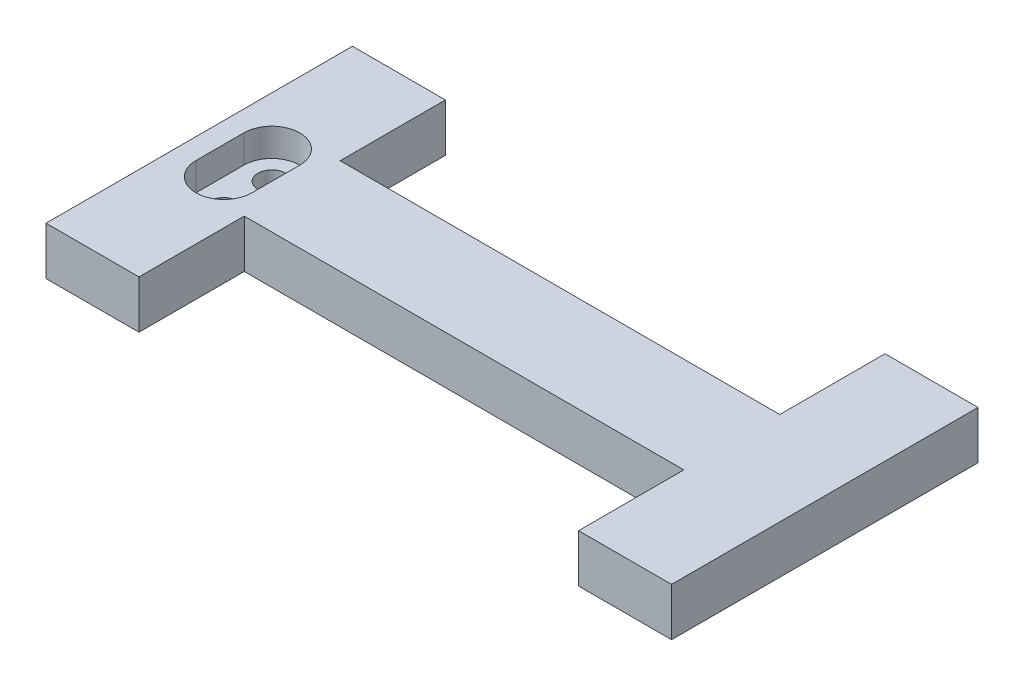
ISO-10303-21;
HEADER;
FILE_DESCRIPTION(('STEP AP214'),'2;1');
FILE_NAME('part.step','',(''),(''),'','','');
FILE_SCHEMA(('AUTOMOTIVE_DESIGN { 1 0 10303 214 1 1 1 1 }'));
ENDSEC;
DATA;
#1=APPLICATION_CONTEXT('core data for automotive mechanical design processes');
#2=APPLICATION_PROTOCOL_DEFINITION('international standard','automotive_design',2000,#1);
#3=PRODUCT_CONTEXT('',#1,'mechanical');
#4=PRODUCT('Part','Part','',(#3));
#5=PRODUCT_RELATED_PRODUCT_CATEGORY('part','',(#4));
#6=PRODUCT_DEFINITION_FORMATION('','',#4);
#7=PRODUCT_DEFINITION_CONTEXT('part definition',#1,'design');
#8=PRODUCT_DEFINITION('design','',#6,#7);
#9=PRODUCT_DEFINITION_SHAPE('','',#8);
#10=(LENGTH_UNIT() NAMED_UNIT(*) SI_UNIT(.MILLI.,.METRE.));
#11=(NAMED_UNIT(*) PLANE_ANGLE_UNIT() SI_UNIT($,.RADIAN.));
#12=(NAMED_UNIT(*) SI_UNIT($,.STERADIAN.) SOLID_ANGLE_UNIT());
#13=UNCERTAINTY_MEASURE_WITH_UNIT(LENGTH_MEASURE(1.E-05),#10,'distance_accuracy_value','');
#14=(GEOMETRIC_REPRESENTATION_CONTEXT(3) GLOBAL_UNCERTAINTY_ASSIGNED_CONTEXT((#13)) GLOBAL_UNIT_ASSIGNED_CONTEXT((#10,
#11,#12)) REPRESENTATION_CONTEXT('',''));
#15=CARTESIAN_POINT('',(0.,0.,0.));
#16=DIRECTION('',(0.,0.,1.));
#17=DIRECTION('',(1.,0.,0.));
#18=AXIS2_PLACEMENT_3D('',#15,#16,#17);
#19=CARTESIAN_POINT('',(-27.5,6.,0.));
#20=DIRECTION('',(1.,0.,0.));
#21=DIRECTION('',(0.,0.,-1.));
#22=AXIS2_PLACEMENT_3D('',#19,#20,#21);
#23=PLANE('',#22);
#24=DIRECTION('',(0.,0.,1.));
#25=VECTOR('',#24,1.);
#26=CARTESIAN_POINT('',(-27.5,0.,0.));
#27=LINE('',#26,#25);
#28=CARTESIAN_POINT('',(-27.5,0.,-19.1706730769231));
#29=VERTEX_POINT('',#28);
#30=CARTESIAN_POINT('',(-27.5,0.,-6.));
#31=VERTEX_POINT('',#30);
#32=EDGE_CURVE('E202',#29,#31,#27,.T.);
#33=ORIENTED_EDGE('',*,*,#32,.F.);
#34=DIRECTION('',(0.,-1.,0.));
#35=VECTOR('',#34,1.);
#36=CARTESIAN_POINT('',(-27.5,6.,-19.1706730769231));
#37=LINE('',#36,#35);
#38=CARTESIAN_POINT('',(-27.5,6.,-19.1706730769231));
#39=VERTEX_POINT('',#38);
#40=EDGE_CURVE('E11',#39,#29,#37,.T.);
#41=ORIENTED_EDGE('',*,*,#40,.F.);
#42=DIRECTION('',(0.,0.,1.));
#43=VECTOR('',#42,1.);
#44=CARTESIAN_POINT('',(-27.5,6.,0.));
#45=LINE('',#44,#43);
#46=CARTESIAN_POINT('',(-27.5,6.,-6.));
#47=VERTEX_POINT('',#46);
#48=EDGE_CURVE('E182',#39,#47,#45,.T.);
#49=ORIENTED_EDGE('',*,*,#48,.T.);
#50=DIRECTION('',(0.,-1.,0.));
#51=VECTOR('',#50,1.);
#52=CARTESIAN_POINT('',(-27.5,6.,-6.));
#53=LINE('',#52,#51);
#54=EDGE_CURVE('E62',#47,#31,#53,.T.);
#55=ORIENTED_EDGE('',*,*,#54,.T.);
#56=EDGE_LOOP('',(#33,#41,#49,#55));
#57=FACE_BOUND('',#56,.T.);
#58=ADVANCED_FACE('F38',(#57),#23,.T.);
#59=CARTESIAN_POINT('',(0.,6.,-19.1706730769231));
#60=DIRECTION('',(0.,0.,-1.));
#61=DIRECTION('',(-1.,0.,0.));
#62=AXIS2_PLACEMENT_3D('',#59,#60,#61);
#63=PLANE('',#62);
#64=DIRECTION('',(1.,0.,0.));
#65=VECTOR('',#64,1.);
#66=CARTESIAN_POINT('',(0.,0.,-19.1706730769231));
#67=LINE('',#66,#65);
#68=CARTESIAN_POINT('',(-39.1346153846154,0.,-19.1706730769231));
#69=VERTEX_POINT('',#68);
#70=EDGE_CURVE('E321',#69,#29,#67,.T.);
#71=ORIENTED_EDGE('',*,*,#70,.F.);
#72=DIRECTION('',(0.,-1.,0.));
#73=VECTOR('',#72,1.);
#74=CARTESIAN_POINT('',(-39.1346153846154,6.,-19.1706730769231));
#75=LINE('',#74,#73);
#76=CARTESIAN_POINT('',(-39.1346153846154,6.,-19.1706730769231));
#77=VERTEX_POINT('',#76);
#78=EDGE_CURVE('E46',#77,#69,#75,.T.);
#79=ORIENTED_EDGE('',*,*,#78,.F.);
#80=DIRECTION('',(1.,0.,0.));
#81=VECTOR('',#80,1.);
#82=CARTESIAN_POINT('',(0.,6.,-19.1706730769231));
#83=LINE('',#82,#81);
#84=EDGE_CURVE('E187',#77,#39,#83,.T.);
#85=ORIENTED_EDGE('',*,*,#84,.T.);
#86=ORIENTED_EDGE('',*,*,#40,.T.);
#87=EDGE_LOOP('',(#71,#79,#85,#86));
#88=FACE_BOUND('',#87,.T.);
#89=ADVANCED_FACE('F40',(#88),#63,.T.);
#90=CARTESIAN_POINT('',(-39.1346153846154,6.,0.));
#91=DIRECTION('',(1.,0.,0.));
#92=DIRECTION('',(0.,0.,-1.));
#93=AXIS2_PLACEMENT_3D('',#90,#91,#92);
#94=PLANE('',#93);
#95=DIRECTION('',(0.,0.,1.));
#96=VECTOR('',#95,1.);
#97=CARTESIAN_POINT('',(-39.1346153846154,0.,0.));
#98=LINE('',#97,#96);
#99=CARTESIAN_POINT('',(-39.1346153846154,0.,19.1706730769231));
#100=VERTEX_POINT('',#99);
#101=EDGE_CURVE('E318',#69,#100,#98,.T.);
#102=ORIENTED_EDGE('',*,*,#101,.T.);
#103=DIRECTION('',(0.,-1.,0.));
#104=VECTOR('',#103,1.);
#105=CARTESIAN_POINT('',(-39.1346153846154,6.,19.1706730769231));
#106=LINE('',#105,#104);
#107=CARTESIAN_POINT('',(-39.1346153846154,6.,19.1706730769231));
#108=VERTEX_POINT('',#107);
#109=EDGE_CURVE('E351',#108,#100,#106,.T.);
#110=ORIENTED_EDGE('',*,*,#109,.F.);
#111=DIRECTION('',(0.,0.,1.));
#112=VECTOR('',#111,1.);
#113=CARTESIAN_POINT('',(-39.1346153846154,6.,0.));
#114=LINE('',#113,#112);
#115=EDGE_CURVE('E185',#77,#108,#114,.T.);
#116=ORIENTED_EDGE('',*,*,#115,.F.);
#117=ORIENTED_EDGE('',*,*,#78,.T.);
#118=EDGE_LOOP('',(#102,#110,#116,#117));
#119=FACE_BOUND('',#118,.T.);
#120=ADVANCED_FACE('F288',(#119),#94,.F.);
#121=CARTESIAN_POINT('',(0.,6.,19.1706730769231));
#122=DIRECTION('',(0.,0.,-1.));
#123=DIRECTION('',(-1.,0.,0.));
#124=AXIS2_PLACEMENT_3D('',#121,#122,#123);
#125=PLANE('',#124);
#126=DIRECTION('',(1.,0.,0.));
#127=VECTOR('',#126,1.);
#128=CARTESIAN_POINT('',(0.,0.,19.1706730769231));
#129=LINE('',#128,#127);
#130=CARTESIAN_POINT('',(-27.5,0.,19.1706730769231));
#131=VERTEX_POINT('',#130);
#132=EDGE_CURVE('E314',#100,#131,#129,.T.);
#133=ORIENTED_EDGE('',*,*,#132,.T.);
#134=DIRECTION('',(0.,-1.,0.));
#135=VECTOR('',#134,1.);
#136=CARTESIAN_POINT('',(-27.5,6.,19.1706730769231));
#137=LINE('',#136,#135);
#138=CARTESIAN_POINT('',(-27.5,6.,19.1706730769231));
#139=VERTEX_POINT('',#138);
#140=EDGE_CURVE('E308',#139,#131,#137,.T.);
#141=ORIENTED_EDGE('',*,*,#140,.F.);
#142=DIRECTION('',(1.,0.,0.));
#143=VECTOR('',#142,1.);
#144=CARTESIAN_POINT('',(0.,6.,19.1706730769231));
#145=LINE('',#144,#143);
#146=EDGE_CURVE('E180',#108,#139,#145,.T.);
#147=ORIENTED_EDGE('',*,*,#146,.F.);
#148=ORIENTED_EDGE('',*,*,#109,.T.);
#149=EDGE_LOOP('',(#133,#141,#147,#148));
#150=FACE_BOUND('',#149,.T.);
#151=ADVANCED_FACE('F294',(#150),#125,.F.);
#152=CARTESIAN_POINT('',(-27.5,0.,6.));
#153=VERTEX_POINT('',#152);
#154=EDGE_CURVE('E305',#153,#131,#27,.T.);
#155=ORIENTED_EDGE('',*,*,#154,.F.);
#156=DIRECTION('',(0.,-1.,0.));
#157=VECTOR('',#156,1.);
#158=CARTESIAN_POINT('',(-27.5,6.,6.));
#159=LINE('',#158,#157);
#160=CARTESIAN_POINT('',(-27.5,6.,6.));
#161=VERTEX_POINT('',#160);
#162=EDGE_CURVE('E306',#161,#153,#159,.T.);
#163=ORIENTED_EDGE('',*,*,#162,.F.);
#164=EDGE_CURVE('E175',#161,#139,#45,.T.);
#165=ORIENTED_EDGE('',*,*,#164,.T.);
#166=ORIENTED_EDGE('',*,*,#140,.T.);
#167=EDGE_LOOP('',(#155,#163,#165,#166));
#168=FACE_BOUND('',#167,.T.);
#169=ADVANCED_FACE('F284',(#168),#23,.T.);
#170=CARTESIAN_POINT('',(0.,6.,6.));
#171=DIRECTION('',(0.,0.,-1.));
#172=DIRECTION('',(-1.,0.,0.));
#173=AXIS2_PLACEMENT_3D('',#170,#171,#172);
#174=PLANE('',#173);
#175=DIRECTION('',(1.,0.,0.));
#176=VECTOR('',#175,1.);
#177=CARTESIAN_POINT('',(0.,0.,6.));
#178=LINE('',#177,#176);
#179=CARTESIAN_POINT('',(27.5,0.,6.));
#180=VERTEX_POINT('',#179);
#181=EDGE_CURVE('E313',#153,#180,#178,.T.);
#182=ORIENTED_EDGE('',*,*,#181,.T.);
#183=DIRECTION('',(0.,-1.,0.));
#184=VECTOR('',#183,1.);
#185=CARTESIAN_POINT('',(27.5,6.,6.));
#186=LINE('',#185,#184);
#187=CARTESIAN_POINT('',(27.5,6.,6.));
#188=VERTEX_POINT('',#187);
#189=EDGE_CURVE('E346',#188,#180,#186,.T.);
#190=ORIENTED_EDGE('',*,*,#189,.F.);
#191=DIRECTION('',(1.,0.,0.));
#192=VECTOR('',#191,1.);
#193=CARTESIAN_POINT('',(0.,6.,6.));
#194=LINE('',#193,#192);
#195=EDGE_CURVE('E171',#161,#188,#194,.T.);
#196=ORIENTED_EDGE('',*,*,#195,.F.);
#197=ORIENTED_EDGE('',*,*,#162,.T.);
#198=EDGE_LOOP('',(#182,#190,#196,#197));
#199=FACE_BOUND('',#198,.T.);
#200=ADVANCED_FACE('F293',(#199),#174,.F.);
#201=CARTESIAN_POINT('',(27.5,6.,0.));
#202=DIRECTION('',(1.,0.,0.));
#203=DIRECTION('',(0.,0.,-1.));
#204=AXIS2_PLACEMENT_3D('',#201,#202,#203);
#205=PLANE('',#204);
#206=DIRECTION('',(0.,0.,1.));
#207=VECTOR('',#206,1.);
#208=CARTESIAN_POINT('',(27.5,0.,0.));
#209=LINE('',#208,#207);
#210=CARTESIAN_POINT('',(27.5,0.,19.1706730769231));
#211=VERTEX_POINT('',#210);
#212=EDGE_CURVE('E316',#180,#211,#209,.T.);
#213=ORIENTED_EDGE('',*,*,#212,.T.);
#214=DIRECTION('',(0.,-1.,0.));
#215=VECTOR('',#214,1.);
#216=CARTESIAN_POINT('',(27.5,6.,19.1706730769231));
#217=LINE('',#216,#215);
#218=CARTESIAN_POINT('',(27.5,6.,19.1706730769231));
#219=VERTEX_POINT('',#218);
#220=EDGE_CURVE('E344',#219,#211,#217,.T.);
#221=ORIENTED_EDGE('',*,*,#220,.F.);
#222=DIRECTION('',(0.,0.,1.));
#223=VECTOR('',#222,1.);
#224=CARTESIAN_POINT('',(27.5,6.,0.));
#225=LINE('',#224,#223);
#226=EDGE_CURVE('E166',#188,#219,#225,.T.);
#227=ORIENTED_EDGE('',*,*,#226,.F.);
#228=ORIENTED_EDGE('',*,*,#189,.T.);
#229=EDGE_LOOP('',(#213,#221,#227,#228));
#230=FACE_BOUND('',#229,.T.);
#231=ADVANCED_FACE('F300',(#230),#205,.F.);
#232=CARTESIAN_POINT('',(0.,6.,19.1706730769231));
#233=DIRECTION('',(0.,0.,1.));
#234=DIRECTION('',(1.,0.,0.));
#235=AXIS2_PLACEMENT_3D('',#232,#233,#234);
#236=PLANE('',#235);
#237=DIRECTION('',(-1.,0.,0.));
#238=VECTOR('',#237,1.);
#239=CARTESIAN_POINT('',(0.,0.,19.1706730769231));
#240=LINE('',#239,#238);
#241=CARTESIAN_POINT('',(39.1346153846154,0.,19.1706730769231));
#242=VERTEX_POINT('',#241);
#243=EDGE_CURVE('E330',#242,#211,#240,.T.);
#244=ORIENTED_EDGE('',*,*,#243,.F.);
#245=DIRECTION('',(0.,-1.,0.));
#246=VECTOR('',#245,1.);
#247=CARTESIAN_POINT('',(39.1346153846154,6.,19.1706730769231));
#248=LINE('',#247,#246);
#249=CARTESIAN_POINT('',(39.1346153846154,6.,19.1706730769231));
#250=VERTEX_POINT('',#249);
#251=EDGE_CURVE('E342',#250,#242,#248,.T.);
#252=ORIENTED_EDGE('',*,*,#251,.F.);
#253=DIRECTION('',(-1.,0.,0.));
#254=VECTOR('',#253,1.);
#255=CARTESIAN_POINT('',(0.,6.,19.1706730769231));
#256=LINE('',#255,#254);
#257=EDGE_CURVE('E170',#250,#219,#256,.T.);
#258=ORIENTED_EDGE('',*,*,#257,.T.);
#259=ORIENTED_EDGE('',*,*,#220,.T.);
#260=EDGE_LOOP('',(#244,#252,#258,#259));
#261=FACE_BOUND('',#260,.T.);
#262=ADVANCED_FACE('F364',(#261),#236,.T.);
#263=CARTESIAN_POINT('',(39.1346153846154,6.,0.));
#264=DIRECTION('',(1.,0.,0.));
#265=DIRECTION('',(0.,0.,-1.));
#266=AXIS2_PLACEMENT_3D('',#263,#264,#265);
#267=PLANE('',#266);
#268=DIRECTION('',(0.,0.,1.));
#269=VECTOR('',#268,1.);
#270=CARTESIAN_POINT('',(39.1346153846154,0.,0.));
#271=LINE('',#270,#269);
#272=CARTESIAN_POINT('',(39.1346153846154,0.,-19.1706730769231));
#273=VERTEX_POINT('',#272);
#274=EDGE_CURVE('E334',#273,#242,#271,.T.);
#275=ORIENTED_EDGE('',*,*,#274,.F.);
#276=DIRECTION('',(0.,-1.,0.));
#277=VECTOR('',#276,1.);
#278=CARTESIAN_POINT('',(39.1346153846154,6.,-19.1706730769231));
#279=LINE('',#278,#277);
#280=CARTESIAN_POINT('',(39.1346153846154,6.,-19.1706730769231));
#281=VERTEX_POINT('',#280);
#282=EDGE_CURVE('E160',#281,#273,#279,.T.);
#283=ORIENTED_EDGE('',*,*,#282,.F.);
#284=DIRECTION('',(0.,0.,1.));
#285=VECTOR('',#284,1.);
#286=CARTESIAN_POINT('',(39.1346153846154,6.,0.));
#287=LINE('',#286,#285);
#288=EDGE_CURVE('E149',#281,#250,#287,.T.);
#289=ORIENTED_EDGE('',*,*,#288,.T.);
#290=ORIENTED_EDGE('',*,*,#251,.T.);
#291=EDGE_LOOP('',(#275,#283,#289,#290));
#292=FACE_BOUND('',#291,.T.);
#293=ADVANCED_FACE('F361',(#292),#267,.T.);
#294=CARTESIAN_POINT('',(0.,6.,-19.1706730769231));
#295=DIRECTION('',(0.,0.,1.));
#296=DIRECTION('',(1.,0.,0.));
#297=AXIS2_PLACEMENT_3D('',#294,#295,#296);
#298=PLANE('',#297);
#299=DIRECTION('',(-1.,0.,0.));
#300=VECTOR('',#299,1.);
#301=CARTESIAN_POINT('',(0.,0.,-19.1706730769231));
#302=LINE('',#301,#300);
#303=CARTESIAN_POINT('',(27.5,0.,-19.1706730769231));
#304=VERTEX_POINT('',#303);
#305=EDGE_CURVE('E156',#273,#304,#302,.T.);
#306=ORIENTED_EDGE('',*,*,#305,.T.);
#307=DIRECTION('',(0.,-1.,0.));
#308=VECTOR('',#307,1.);
#309=CARTESIAN_POINT('',(27.5,6.,-19.1706730769231));
#310=LINE('',#309,#308);
#311=CARTESIAN_POINT('',(27.5,6.,-19.1706730769231));
#312=VERTEX_POINT('',#311);
#313=EDGE_CURVE('E153',#312,#304,#310,.T.);
#314=ORIENTED_EDGE('',*,*,#313,.F.);
#315=DIRECTION('',(-1.,0.,0.));
#316=VECTOR('',#315,1.);
#317=CARTESIAN_POINT('',(0.,6.,-19.1706730769231));
#318=LINE('',#317,#316);
#319=EDGE_CURVE('E140',#281,#312,#318,.T.);
#320=ORIENTED_EDGE('',*,*,#319,.F.);
#321=ORIENTED_EDGE('',*,*,#282,.T.);
#322=EDGE_LOOP('',(#306,#314,#320,#321));
#323=FACE_BOUND('',#322,.T.);
#324=ADVANCED_FACE('F154',(#323),#298,.F.);
#325=CARTESIAN_POINT('',(27.5,0.,-6.));
#326=VERTEX_POINT('',#325);
#327=EDGE_CURVE('E331',#304,#326,#209,.T.);
#328=ORIENTED_EDGE('',*,*,#327,.T.);
#329=DIRECTION('',(0.,-1.,0.));
#330=VECTOR('',#329,1.);
#331=CARTESIAN_POINT('',(27.5,6.,-6.));
#332=LINE('',#331,#330);
#333=CARTESIAN_POINT('',(27.5,6.,-6.));
#334=VERTEX_POINT('',#333);
#335=EDGE_CURVE('E161',#334,#326,#332,.T.);
#336=ORIENTED_EDGE('',*,*,#335,.F.);
#337=EDGE_CURVE('E145',#312,#334,#225,.T.);
#338=ORIENTED_EDGE('',*,*,#337,.F.);
#339=ORIENTED_EDGE('',*,*,#313,.T.);
#340=EDGE_LOOP('',(#328,#336,#338,#339));
#341=FACE_BOUND('',#340,.T.);
#342=ADVANCED_FACE('F163',(#341),#205,.F.);
#343=CARTESIAN_POINT('',(0.,6.,-6.));
#344=DIRECTION('',(0.,0.,-1.));
#345=DIRECTION('',(-1.,0.,0.));
#346=AXIS2_PLACEMENT_3D('',#343,#344,#345);
#347=PLANE('',#346);
#348=DIRECTION('',(1.,0.,0.));
#349=VECTOR('',#348,1.);
#350=CARTESIAN_POINT('',(0.,0.,-6.));
#351=LINE('',#350,#349);
#352=EDGE_CURVE('E190',#31,#326,#351,.T.);
#353=ORIENTED_EDGE('',*,*,#352,.F.);
#354=ORIENTED_EDGE('',*,*,#54,.F.);
#355=DIRECTION('',(1.,0.,0.));
#356=VECTOR('',#355,1.);
#357=CARTESIAN_POINT('',(0.,6.,-6.));
#358=LINE('',#357,#356);
#359=EDGE_CURVE('E164',#47,#334,#358,.T.);
#360=ORIENTED_EDGE('',*,*,#359,.T.);
#361=ORIENTED_EDGE('',*,*,#335,.T.);
#362=EDGE_LOOP('',(#353,#354,#360,#361));
#363=FACE_BOUND('',#362,.T.);
#364=ADVANCED_FACE('F358',(#363),#347,.T.);
#365=CARTESIAN_POINT('',(0.,6.,0.));
#366=DIRECTION('',(0.,1.,0.));
#367=DIRECTION('',(0.,0.,1.));
#368=AXIS2_PLACEMENT_3D('',#365,#366,#367);
#369=PLANE('',#368);
#370=CARTESIAN_POINT('',(-33.0442009175895,6.,-3.));
#371=DIRECTION('',(0.,1.,0.));
#372=DIRECTION('',(0.,0.,1.));
#373=AXIS2_PLACEMENT_3D('',#370,#371,#372);
#374=CIRCLE('',#373,3.5);
#375=CARTESIAN_POINT('',(-29.5442009175895,6.,-2.99999999999999));
#376=VERTEX_POINT('',#375);
#377=CARTESIAN_POINT('',(-36.5442009175895,6.,-2.99999999999999));
#378=VERTEX_POINT('',#377);
#379=EDGE_CURVE('E53',#376,#378,#374,.T.);
#380=ORIENTED_EDGE('',*,*,#379,.F.);
#381=DIRECTION('',(0.,0.,-1.));
#382=VECTOR('',#381,1.);
#383=CARTESIAN_POINT('',(-29.5442009175895,6.,-2.99999999999999));
#384=LINE('',#383,#382);
#385=CARTESIAN_POINT('',(-29.5442009175895,6.,3.));
#386=VERTEX_POINT('',#385);
#387=EDGE_CURVE('E203',#386,#376,#384,.T.);
#388=ORIENTED_EDGE('',*,*,#387,.F.);
#389=CARTESIAN_POINT('',(-33.0442009175895,6.,3.));
#390=DIRECTION('',(0.,1.,0.));
#391=DIRECTION('',(0.,0.,1.));
#392=AXIS2_PLACEMENT_3D('',#389,#390,#391);
#393=CIRCLE('',#392,3.5);
#394=CARTESIAN_POINT('',(-36.5442009175895,6.,3.));
#395=VERTEX_POINT('',#394);
#396=EDGE_CURVE('E207',#395,#386,#393,.T.);
#397=ORIENTED_EDGE('',*,*,#396,.F.);
#398=DIRECTION('',(0.,0.,1.));
#399=VECTOR('',#398,1.);
#400=CARTESIAN_POINT('',(-36.5442009175895,6.,-2.99999999999999));
#401=LINE('',#400,#399);
#402=EDGE_CURVE('E210',#378,#395,#401,.T.);
#403=ORIENTED_EDGE('',*,*,#402,.F.);
#404=EDGE_LOOP('',(#380,#388,#397,#403));
#405=FACE_BOUND('',#404,.T.);
#406=ORIENTED_EDGE('',*,*,#48,.F.);
#407=ORIENTED_EDGE('',*,*,#84,.F.);
#408=ORIENTED_EDGE('',*,*,#115,.T.);
#409=ORIENTED_EDGE('',*,*,#146,.T.);
#410=ORIENTED_EDGE('',*,*,#164,.F.);
#411=ORIENTED_EDGE('',*,*,#195,.T.);
#412=ORIENTED_EDGE('',*,*,#226,.T.);
#413=ORIENTED_EDGE('',*,*,#257,.F.);
#414=ORIENTED_EDGE('',*,*,#288,.F.);
#415=ORIENTED_EDGE('',*,*,#319,.T.);
#416=ORIENTED_EDGE('',*,*,#337,.T.);
#417=ORIENTED_EDGE('',*,*,#359,.F.);
#418=EDGE_LOOP('',(#406,#407,#408,#409,#410,#411,#412,#413,#414,#415,#416,#417));
#419=FACE_BOUND('',#418,.T.);
#420=ADVANCED_FACE('F142',(#405,#419),#369,.T.);
#421=CARTESIAN_POINT('',(0.,0.,0.));
#422=DIRECTION('',(0.,1.,0.));
#423=DIRECTION('',(0.,0.,1.));
#424=AXIS2_PLACEMENT_3D('',#421,#422,#423);
#425=PLANE('',#424);
#426=CARTESIAN_POINT('',(-33.0442009175895,0.,-3.));
#427=DIRECTION('',(0.,1.,0.));
#428=DIRECTION('',(0.,0.,1.));
#429=AXIS2_PLACEMENT_3D('',#426,#427,#428);
#430=CIRCLE('',#429,1.75);
#431=CARTESIAN_POINT('',(-33.0442009175895,0.,-1.25));
#432=VERTEX_POINT('',#431);
#433=EDGE_CURVE('E214',#432,#432,#430,.T.);
#434=ORIENTED_EDGE('',*,*,#433,.T.);
#435=EDGE_LOOP('',(#434));
#436=FACE_BOUND('',#435,.T.);
#437=CARTESIAN_POINT('',(-33.0442009175895,0.,3.));
#438=DIRECTION('',(0.,1.,0.));
#439=DIRECTION('',(0.,0.,1.));
#440=AXIS2_PLACEMENT_3D('',#437,#438,#439);
#441=CIRCLE('',#440,1.75);
#442=CARTESIAN_POINT('',(-33.0442009175895,0.,4.75));
#443=VERTEX_POINT('',#442);
#444=EDGE_CURVE('E227',#443,#443,#441,.T.);
#445=ORIENTED_EDGE('',*,*,#444,.T.);
#446=EDGE_LOOP('',(#445));
#447=FACE_BOUND('',#446,.T.);
#448=ORIENTED_EDGE('',*,*,#32,.T.);
#449=ORIENTED_EDGE('',*,*,#352,.T.);
#450=ORIENTED_EDGE('',*,*,#327,.F.);
#451=ORIENTED_EDGE('',*,*,#305,.F.);
#452=ORIENTED_EDGE('',*,*,#274,.T.);
#453=ORIENTED_EDGE('',*,*,#243,.T.);
#454=ORIENTED_EDGE('',*,*,#212,.F.);
#455=ORIENTED_EDGE('',*,*,#181,.F.);
#456=ORIENTED_EDGE('',*,*,#154,.T.);
#457=ORIENTED_EDGE('',*,*,#132,.F.);
#458=ORIENTED_EDGE('',*,*,#101,.F.);
#459=ORIENTED_EDGE('',*,*,#70,.T.);
#460=EDGE_LOOP('',(#448,#449,#450,#451,#452,#453,#454,#455,#456,#457,#458,#459));
#461=FACE_BOUND('',#460,.T.);
#462=ADVANCED_FACE('F357',(#436,#447,#461),#425,.F.);
#463=CARTESIAN_POINT('',(-33.0442009175895,2.5,-3.));
#464=DIRECTION('',(0.,1.,0.));
#465=DIRECTION('',(0.,0.,1.));
#466=AXIS2_PLACEMENT_3D('',#463,#464,#465);
#467=CYLINDRICAL_SURFACE('',#466,3.5);
#468=ORIENTED_EDGE('',*,*,#379,.T.);
#469=DIRECTION('',(0.,1.,0.));
#470=VECTOR('',#469,1.);
#471=CARTESIAN_POINT('',(-36.5442009175895,2.5,-2.99999999999999));
#472=LINE('',#471,#470);
#473=CARTESIAN_POINT('',(-36.5442009175895,2.5,-2.99999999999999));
#474=VERTEX_POINT('',#473);
#475=EDGE_CURVE('E191',#474,#378,#472,.T.);
#476=ORIENTED_EDGE('',*,*,#475,.F.);
#477=CARTESIAN_POINT('',(-33.0442009175895,2.5,-3.));
#478=DIRECTION('',(0.,1.,0.));
#479=DIRECTION('',(0.,0.,1.));
#480=AXIS2_PLACEMENT_3D('',#477,#478,#479);
#481=CIRCLE('',#480,3.5);
#482=CARTESIAN_POINT('',(-29.5442009175895,2.5,-2.99999999999999));
#483=VERTEX_POINT('',#482);
#484=EDGE_CURVE('E206',#483,#474,#481,.T.);
#485=ORIENTED_EDGE('',*,*,#484,.F.);
#486=DIRECTION('',(0.,1.,0.));
#487=VECTOR('',#486,1.);
#488=CARTESIAN_POINT('',(-29.5442009175895,2.5,-2.99999999999999));
#489=LINE('',#488,#487);
#490=EDGE_CURVE('E200',#483,#376,#489,.T.);
#491=ORIENTED_EDGE('',*,*,#490,.T.);
#492=EDGE_LOOP('',(#468,#476,#485,#491));
#493=FACE_BOUND('',#492,.T.);
#494=ADVANCED_FACE('F254',(#493),#467,.F.);
#495=CARTESIAN_POINT('',(-29.5442009175895,2.5,-2.99999999999999));
#496=DIRECTION('',(1.,0.,0.));
#497=DIRECTION('',(0.,0.,-1.));
#498=AXIS2_PLACEMENT_3D('',#495,#496,#497);
#499=PLANE('',#498);
#500=ORIENTED_EDGE('',*,*,#387,.T.);
#501=ORIENTED_EDGE('',*,*,#490,.F.);
#502=DIRECTION('',(0.,0.,-1.));
#503=VECTOR('',#502,1.);
#504=CARTESIAN_POINT('',(-29.5442009175895,2.5,-2.99999999999999));
#505=LINE('',#504,#503);
#506=CARTESIAN_POINT('',(-29.5442009175895,2.5,3.));
#507=VERTEX_POINT('',#506);
#508=EDGE_CURVE('E194',#507,#483,#505,.T.);
#509=ORIENTED_EDGE('',*,*,#508,.F.);
#510=DIRECTION('',(0.,1.,0.));
#511=VECTOR('',#510,1.);
#512=CARTESIAN_POINT('',(-29.5442009175895,2.5,3.));
#513=LINE('',#512,#511);
#514=EDGE_CURVE('E197',#507,#386,#513,.T.);
#515=ORIENTED_EDGE('',*,*,#514,.T.);
#516=EDGE_LOOP('',(#500,#501,#509,#515));
#517=FACE_BOUND('',#516,.T.);
#518=ADVANCED_FACE('F265',(#517),#499,.F.);
#519=CARTESIAN_POINT('',(-33.0442009175895,2.5,3.));
#520=DIRECTION('',(0.,1.,0.));
#521=DIRECTION('',(0.,0.,1.));
#522=AXIS2_PLACEMENT_3D('',#519,#520,#521);
#523=CYLINDRICAL_SURFACE('',#522,3.5);
#524=ORIENTED_EDGE('',*,*,#396,.T.);
#525=ORIENTED_EDGE('',*,*,#514,.F.);
#526=CARTESIAN_POINT('',(-33.0442009175895,2.5,3.));
#527=DIRECTION('',(0.,1.,0.));
#528=DIRECTION('',(0.,0.,1.));
#529=AXIS2_PLACEMENT_3D('',#526,#527,#528);
#530=CIRCLE('',#529,3.5);
#531=CARTESIAN_POINT('',(-36.5442009175895,2.5,3.));
#532=VERTEX_POINT('',#531);
#533=EDGE_CURVE('E217',#532,#507,#530,.T.);
#534=ORIENTED_EDGE('',*,*,#533,.F.);
#535=DIRECTION('',(0.,1.,0.));
#536=VECTOR('',#535,1.);
#537=CARTESIAN_POINT('',(-36.5442009175895,2.5,3.));
#538=LINE('',#537,#536);
#539=EDGE_CURVE('E193',#532,#395,#538,.T.);
#540=ORIENTED_EDGE('',*,*,#539,.T.);
#541=EDGE_LOOP('',(#524,#525,#534,#540));
#542=FACE_BOUND('',#541,.T.);
#543=ADVANCED_FACE('F270',(#542),#523,.F.);
#544=CARTESIAN_POINT('',(-36.5442009175895,2.5,-2.99999999999999));
#545=DIRECTION('',(-1.,0.,0.));
#546=DIRECTION('',(0.,0.,1.));
#547=AXIS2_PLACEMENT_3D('',#544,#545,#546);
#548=PLANE('',#547);
#549=ORIENTED_EDGE('',*,*,#402,.T.);
#550=ORIENTED_EDGE('',*,*,#539,.F.);
#551=DIRECTION('',(0.,0.,1.));
#552=VECTOR('',#551,1.);
#553=CARTESIAN_POINT('',(-36.5442009175895,2.5,-2.99999999999999));
#554=LINE('',#553,#552);
#555=EDGE_CURVE('E220',#474,#532,#554,.T.);
#556=ORIENTED_EDGE('',*,*,#555,.F.);
#557=ORIENTED_EDGE('',*,*,#475,.T.);
#558=EDGE_LOOP('',(#549,#550,#556,#557));
#559=FACE_BOUND('',#558,.T.);
#560=ADVANCED_FACE('F244',(#559),#548,.F.);
#561=CARTESIAN_POINT('',(-33.0442009175895,2.5,-3.));
#562=DIRECTION('',(0.,1.,0.));
#563=DIRECTION('',(0.,0.,1.));
#564=AXIS2_PLACEMENT_3D('',#561,#562,#563);
#565=PLANE('',#564);
#566=CARTESIAN_POINT('',(-33.0442009175895,2.5,-3.));
#567=DIRECTION('',(0.,1.,0.));
#568=DIRECTION('',(0.,0.,1.));
#569=AXIS2_PLACEMENT_3D('',#566,#567,#568);
#570=CIRCLE('',#569,1.75);
#571=CARTESIAN_POINT('',(-33.0442009175895,2.5,-1.25));
#572=VERTEX_POINT('',#571);
#573=EDGE_CURVE('E230',#572,#572,#570,.T.);
#574=ORIENTED_EDGE('',*,*,#573,.F.);
#575=EDGE_LOOP('',(#574));
#576=FACE_BOUND('',#575,.T.);
#577=CARTESIAN_POINT('',(-33.0442009175895,2.5,3.));
#578=DIRECTION('',(0.,1.,0.));
#579=DIRECTION('',(0.,0.,1.));
#580=AXIS2_PLACEMENT_3D('',#577,#578,#579);
#581=CIRCLE('',#580,1.75);
#582=CARTESIAN_POINT('',(-33.0442009175895,2.5,4.75));
#583=VERTEX_POINT('',#582);
#584=EDGE_CURVE('E231',#583,#583,#581,.T.);
#585=ORIENTED_EDGE('',*,*,#584,.F.);
#586=EDGE_LOOP('',(#585));
#587=FACE_BOUND('',#586,.T.);
#588=ORIENTED_EDGE('',*,*,#484,.T.);
#589=ORIENTED_EDGE('',*,*,#555,.T.);
#590=ORIENTED_EDGE('',*,*,#533,.T.);
#591=ORIENTED_EDGE('',*,*,#508,.T.);
#592=EDGE_LOOP('',(#588,#589,#590,#591));
#593=FACE_BOUND('',#592,.T.);
#594=ADVANCED_FACE('F240',(#576,#587,#593),#565,.T.);
#595=CARTESIAN_POINT('',(-33.0442009175895,-1.5,3.));
#596=DIRECTION('',(0.,1.,0.));
#597=DIRECTION('',(0.,0.,1.));
#598=AXIS2_PLACEMENT_3D('',#595,#596,#597);
#599=CYLINDRICAL_SURFACE('',#598,1.75);
#600=ORIENTED_EDGE('',*,*,#584,.T.);
#601=EDGE_LOOP('',(#600));
#602=FACE_BOUND('',#601,.T.);
#603=ORIENTED_EDGE('',*,*,#444,.F.);
#604=EDGE_LOOP('',(#603));
#605=FACE_BOUND('',#604,.T.);
#606=ADVANCED_FACE('F243',(#602,#605),#599,.F.);
#607=CARTESIAN_POINT('',(-33.0442009175895,-1.5,-3.));
#608=DIRECTION('',(0.,1.,0.));
#609=DIRECTION('',(0.,0.,1.));
#610=AXIS2_PLACEMENT_3D('',#607,#608,#609);
#611=CYLINDRICAL_SURFACE('',#610,1.75);
#612=ORIENTED_EDGE('',*,*,#573,.T.);
#613=EDGE_LOOP('',(#612));
#614=FACE_BOUND('',#613,.T.);
#615=ORIENTED_EDGE('',*,*,#433,.F.);
#616=EDGE_LOOP('',(#615));
#617=FACE_BOUND('',#616,.T.);
#618=ADVANCED_FACE('F237',(#614,#617),#611,.F.);
#619=CLOSED_SHELL('',(#58,#89,#120,#151,#169,#200,#231,#262,#293,#324,#342,#364,#420,#462,#494,
#518,#543,#560,#594,#606,#618));
#620=MANIFOLD_SOLID_BREP('B2',#619);
#621=ADVANCED_BREP_SHAPE_REPRESENTATION('',(#18,#620),#14);
#622=SHAPE_DEFINITION_REPRESENTATION(#9,#621);
ENDSEC;
END-ISO-10303-21;
